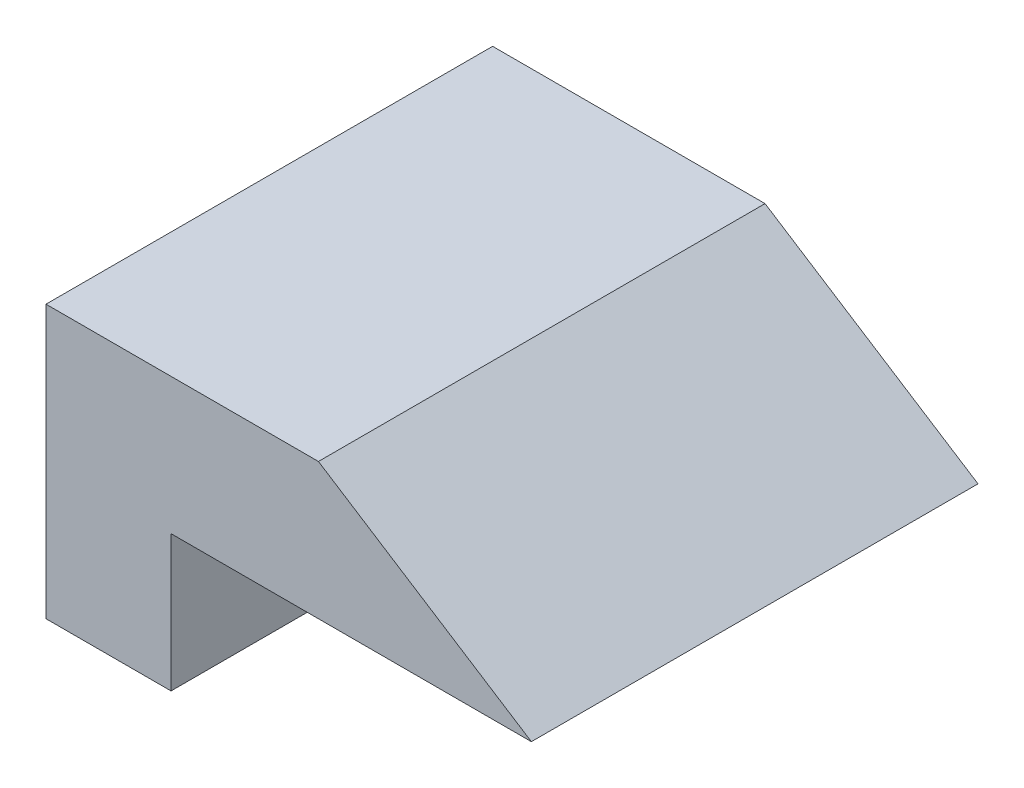
ISO-10303-21;
HEADER;
FILE_DESCRIPTION(('STEP AP214'),'2;1');
FILE_NAME('part.step','',(''),(''),'','','');
FILE_SCHEMA(('AUTOMOTIVE_DESIGN { 1 0 10303 214 1 1 1 1 }'));
ENDSEC;
DATA;
#1=APPLICATION_CONTEXT('core data for automotive mechanical design processes');
#2=APPLICATION_PROTOCOL_DEFINITION('international standard','automotive_design',2000,#1);
#3=PRODUCT_CONTEXT('',#1,'mechanical');
#4=PRODUCT('Part','Part','',(#3));
#5=PRODUCT_RELATED_PRODUCT_CATEGORY('part','',(#4));
#6=PRODUCT_DEFINITION_FORMATION('','',#4);
#7=PRODUCT_DEFINITION_CONTEXT('part definition',#1,'design');
#8=PRODUCT_DEFINITION('design','',#6,#7);
#9=PRODUCT_DEFINITION_SHAPE('','',#8);
#10=(LENGTH_UNIT() NAMED_UNIT(*) SI_UNIT(.MILLI.,.METRE.));
#11=(NAMED_UNIT(*) PLANE_ANGLE_UNIT() SI_UNIT($,.RADIAN.));
#12=(NAMED_UNIT(*) SI_UNIT($,.STERADIAN.) SOLID_ANGLE_UNIT());
#13=UNCERTAINTY_MEASURE_WITH_UNIT(LENGTH_MEASURE(1.E-05),#10,'distance_accuracy_value','');
#14=(GEOMETRIC_REPRESENTATION_CONTEXT(3) GLOBAL_UNCERTAINTY_ASSIGNED_CONTEXT((#13)) GLOBAL_UNIT_ASSIGNED_CONTEXT((#10,
#11,#12)) REPRESENTATION_CONTEXT('',''));
#15=CARTESIAN_POINT('',(0.,0.,0.));
#16=DIRECTION('',(0.,0.,1.));
#17=DIRECTION('',(1.,0.,0.));
#18=AXIS2_PLACEMENT_3D('',#15,#16,#17);
#19=CARTESIAN_POINT('',(0.,3.05,10.));
#20=DIRECTION('',(0.,-1.,0.));
#21=DIRECTION('',(1.,0.,0.));
#22=AXIS2_PLACEMENT_3D('',#19,#20,#21);
#23=PLANE('',#22);
#24=DIRECTION('',(-1.,0.,0.));
#25=VECTOR('',#24,1.);
#26=CARTESIAN_POINT('',(0.,3.05,0.));
#27=LINE('',#26,#25);
#28=CARTESIAN_POINT('',(-4.76772117763126,3.05,0.));
#29=VERTEX_POINT('',#28);
#30=CARTESIAN_POINT('',(-10.8677211776313,3.05,0.));
#31=VERTEX_POINT('',#30);
#32=EDGE_CURVE('E163',#29,#31,#27,.T.);
#33=ORIENTED_EDGE('',*,*,#32,.T.);
#34=DIRECTION('',(0.,0.,-1.));
#35=VECTOR('',#34,1.);
#36=CARTESIAN_POINT('',(-10.8677211776313,3.05,10.));
#37=LINE('',#36,#35);
#38=CARTESIAN_POINT('',(-10.8677211776313,3.05,10.));
#39=VERTEX_POINT('',#38);
#40=EDGE_CURVE('E12',#39,#31,#37,.T.);
#41=ORIENTED_EDGE('',*,*,#40,.F.);
#42=DIRECTION('',(-1.,0.,0.));
#43=VECTOR('',#42,1.);
#44=CARTESIAN_POINT('',(0.,3.05,10.));
#45=LINE('',#44,#43);
#46=CARTESIAN_POINT('',(-4.76772117763126,3.05,10.));
#47=VERTEX_POINT('',#46);
#48=EDGE_CURVE('E92',#47,#39,#45,.T.);
#49=ORIENTED_EDGE('',*,*,#48,.F.);
#50=DIRECTION('',(0.,0.,-1.));
#51=VECTOR('',#50,1.);
#52=CARTESIAN_POINT('',(-4.76772117763126,3.05,10.));
#53=LINE('',#52,#51);
#54=EDGE_CURVE('E124',#47,#29,#53,.T.);
#55=ORIENTED_EDGE('',*,*,#54,.T.);
#56=EDGE_LOOP('',(#33,#41,#49,#55));
#57=FACE_BOUND('',#56,.T.);
#58=ADVANCED_FACE('F42',(#57),#23,.F.);
#59=CARTESIAN_POINT('',(-10.8677211776313,0.,10.));
#60=DIRECTION('',(-1.,0.,0.));
#61=DIRECTION('',(0.,0.,1.));
#62=AXIS2_PLACEMENT_3D('',#59,#60,#61);
#63=PLANE('',#62);
#64=DIRECTION('',(0.,1.,0.));
#65=VECTOR('',#64,1.);
#66=CARTESIAN_POINT('',(-10.8677211776313,0.,0.));
#67=LINE('',#66,#65);
#68=CARTESIAN_POINT('',(-10.8677211776313,-3.05,0.));
#69=VERTEX_POINT('',#68);
#70=EDGE_CURVE('E159',#69,#31,#67,.T.);
#71=ORIENTED_EDGE('',*,*,#70,.F.);
#72=DIRECTION('',(0.,0.,-1.));
#73=VECTOR('',#72,1.);
#74=CARTESIAN_POINT('',(-10.8677211776313,-3.05,10.));
#75=LINE('',#74,#73);
#76=CARTESIAN_POINT('',(-10.8677211776313,-3.05,10.));
#77=VERTEX_POINT('',#76);
#78=EDGE_CURVE('E55',#77,#69,#75,.T.);
#79=ORIENTED_EDGE('',*,*,#78,.F.);
#80=DIRECTION('',(0.,1.,0.));
#81=VECTOR('',#80,1.);
#82=CARTESIAN_POINT('',(-10.8677211776313,0.,10.));
#83=LINE('',#82,#81);
#84=EDGE_CURVE('E138',#77,#39,#83,.T.);
#85=ORIENTED_EDGE('',*,*,#84,.T.);
#86=ORIENTED_EDGE('',*,*,#40,.T.);
#87=EDGE_LOOP('',(#71,#79,#85,#86));
#88=FACE_BOUND('',#87,.T.);
#89=ADVANCED_FACE('F158',(#88),#63,.T.);
#90=CARTESIAN_POINT('',(0.,-3.05,10.));
#91=DIRECTION('',(0.,-1.,0.));
#92=DIRECTION('',(0.,0.,-1.));
#93=AXIS2_PLACEMENT_3D('',#90,#91,#92);
#94=PLANE('',#93);
#95=DIRECTION('',(-1.,0.,0.));
#96=VECTOR('',#95,1.);
#97=CARTESIAN_POINT('',(0.,-3.05,0.));
#98=LINE('',#97,#96);
#99=CARTESIAN_POINT('',(-8.06772117763126,-3.05,0.));
#100=VERTEX_POINT('',#99);
#101=EDGE_CURVE('E157',#100,#69,#98,.T.);
#102=ORIENTED_EDGE('',*,*,#101,.F.);
#103=DIRECTION('',(0.,0.,-1.));
#104=VECTOR('',#103,1.);
#105=CARTESIAN_POINT('',(-8.06772117763126,-3.05,10.));
#106=LINE('',#105,#104);
#107=CARTESIAN_POINT('',(-8.06772117763126,-3.05,10.));
#108=VERTEX_POINT('',#107);
#109=EDGE_CURVE('E119',#108,#100,#106,.T.);
#110=ORIENTED_EDGE('',*,*,#109,.F.);
#111=DIRECTION('',(-1.,0.,0.));
#112=VECTOR('',#111,1.);
#113=CARTESIAN_POINT('',(0.,-3.05,10.));
#114=LINE('',#113,#112);
#115=EDGE_CURVE('E110',#108,#77,#114,.T.);
#116=ORIENTED_EDGE('',*,*,#115,.T.);
#117=ORIENTED_EDGE('',*,*,#78,.T.);
#118=EDGE_LOOP('',(#102,#110,#116,#117));
#119=FACE_BOUND('',#118,.T.);
#120=ADVANCED_FACE('F153',(#119),#94,.T.);
#121=CARTESIAN_POINT('',(-8.06772117763126,0.,10.));
#122=DIRECTION('',(-1.,0.,0.));
#123=DIRECTION('',(0.,0.,1.));
#124=AXIS2_PLACEMENT_3D('',#121,#122,#123);
#125=PLANE('',#124);
#126=DIRECTION('',(0.,1.,0.));
#127=VECTOR('',#126,1.);
#128=CARTESIAN_POINT('',(-8.06772117763126,0.,0.));
#129=LINE('',#128,#127);
#130=CARTESIAN_POINT('',(-8.06772117763126,0.,0.));
#131=VERTEX_POINT('',#130);
#132=EDGE_CURVE('E117',#100,#131,#129,.T.);
#133=ORIENTED_EDGE('',*,*,#132,.T.);
#134=DIRECTION('',(0.,0.,-1.));
#135=VECTOR('',#134,1.);
#136=CARTESIAN_POINT('',(-8.06772117763126,0.,10.));
#137=LINE('',#136,#135);
#138=CARTESIAN_POINT('',(-8.06772117763126,0.,10.));
#139=VERTEX_POINT('',#138);
#140=EDGE_CURVE('E114',#139,#131,#137,.T.);
#141=ORIENTED_EDGE('',*,*,#140,.F.);
#142=DIRECTION('',(0.,1.,0.));
#143=VECTOR('',#142,1.);
#144=CARTESIAN_POINT('',(-8.06772117763126,0.,10.));
#145=LINE('',#144,#143);
#146=EDGE_CURVE('E101',#108,#139,#145,.T.);
#147=ORIENTED_EDGE('',*,*,#146,.F.);
#148=ORIENTED_EDGE('',*,*,#109,.T.);
#149=EDGE_LOOP('',(#133,#141,#147,#148));
#150=FACE_BOUND('',#149,.T.);
#151=ADVANCED_FACE('F113',(#150),#125,.F.);
#152=CARTESIAN_POINT('',(0.,0.,10.));
#153=DIRECTION('',(0.,1.,0.));
#154=DIRECTION('',(0.,0.,1.));
#155=AXIS2_PLACEMENT_3D('',#152,#153,#154);
#156=PLANE('',#155);
#157=DIRECTION('',(1.,0.,0.));
#158=VECTOR('',#157,1.);
#159=CARTESIAN_POINT('',(0.,0.,0.));
#160=LINE('',#159,#158);
#161=CARTESIAN_POINT('',(0.,0.,0.));
#162=VERTEX_POINT('',#161);
#163=EDGE_CURVE('E85',#131,#162,#160,.T.);
#164=ORIENTED_EDGE('',*,*,#163,.T.);
#165=DIRECTION('',(0.,0.,-1.));
#166=VECTOR('',#165,1.);
#167=CARTESIAN_POINT('',(0.,0.,10.));
#168=LINE('',#167,#166);
#169=CARTESIAN_POINT('',(0.,0.,10.));
#170=VERTEX_POINT('',#169);
#171=EDGE_CURVE('E118',#170,#162,#168,.T.);
#172=ORIENTED_EDGE('',*,*,#171,.F.);
#173=DIRECTION('',(1.,0.,0.));
#174=VECTOR('',#173,1.);
#175=CARTESIAN_POINT('',(0.,0.,10.));
#176=LINE('',#175,#174);
#177=EDGE_CURVE('E109',#139,#170,#176,.T.);
#178=ORIENTED_EDGE('',*,*,#177,.F.);
#179=ORIENTED_EDGE('',*,*,#140,.T.);
#180=EDGE_LOOP('',(#164,#172,#178,#179));
#181=FACE_BOUND('',#180,.T.);
#182=ADVANCED_FACE('F123',(#181),#156,.F.);
#183=CARTESIAN_POINT('',(0.,0.,10.));
#184=DIRECTION('',(-0.538885531043225,-0.842379002843887,0.));
#185=DIRECTION('',(0.842379002843887,-0.538885531043225,0.));
#186=AXIS2_PLACEMENT_3D('',#183,#184,#185);
#187=PLANE('',#186);
#188=DIRECTION('',(-0.842379002843887,0.538885531043225,0.));
#189=VECTOR('',#188,1.);
#190=CARTESIAN_POINT('',(0.,0.,0.));
#191=LINE('',#190,#189);
#192=EDGE_CURVE('E88',#162,#29,#191,.T.);
#193=ORIENTED_EDGE('',*,*,#192,.T.);
#194=ORIENTED_EDGE('',*,*,#54,.F.);
#195=DIRECTION('',(-0.842379002843887,0.538885531043225,0.));
#196=VECTOR('',#195,1.);
#197=CARTESIAN_POINT('',(0.,0.,10.));
#198=LINE('',#197,#196);
#199=EDGE_CURVE('E58',#170,#47,#198,.T.);
#200=ORIENTED_EDGE('',*,*,#199,.F.);
#201=ORIENTED_EDGE('',*,*,#171,.T.);
#202=EDGE_LOOP('',(#193,#194,#200,#201));
#203=FACE_BOUND('',#202,.T.);
#204=ADVANCED_FACE('F170',(#203),#187,.F.);
#205=CARTESIAN_POINT('',(0.,0.,10.));
#206=DIRECTION('',(0.,0.,1.));
#207=DIRECTION('',(1.,0.,0.));
#208=AXIS2_PLACEMENT_3D('',#205,#206,#207);
#209=PLANE('',#208);
#210=ORIENTED_EDGE('',*,*,#48,.T.);
#211=ORIENTED_EDGE('',*,*,#84,.F.);
#212=ORIENTED_EDGE('',*,*,#115,.F.);
#213=ORIENTED_EDGE('',*,*,#146,.T.);
#214=ORIENTED_EDGE('',*,*,#177,.T.);
#215=ORIENTED_EDGE('',*,*,#199,.T.);
#216=EDGE_LOOP('',(#210,#211,#212,#213,#214,#215));
#217=FACE_BOUND('',#216,.T.);
#218=ADVANCED_FACE('F106',(#217),#209,.T.);
#219=CARTESIAN_POINT('',(0.,0.,0.));
#220=DIRECTION('',(0.,0.,1.));
#221=DIRECTION('',(1.,0.,0.));
#222=AXIS2_PLACEMENT_3D('',#219,#220,#221);
#223=PLANE('',#222);
#224=ORIENTED_EDGE('',*,*,#32,.F.);
#225=ORIENTED_EDGE('',*,*,#192,.F.);
#226=ORIENTED_EDGE('',*,*,#163,.F.);
#227=ORIENTED_EDGE('',*,*,#132,.F.);
#228=ORIENTED_EDGE('',*,*,#101,.T.);
#229=ORIENTED_EDGE('',*,*,#70,.T.);
#230=EDGE_LOOP('',(#224,#225,#226,#227,#228,#229));
#231=FACE_BOUND('',#230,.T.);
#232=ADVANCED_FACE('F168',(#231),#223,.F.);
#233=CLOSED_SHELL('',(#58,#89,#120,#151,#182,#204,#218,#232));
#234=MANIFOLD_SOLID_BREP('B2',#233);
#235=ADVANCED_BREP_SHAPE_REPRESENTATION('',(#18,#234),#14);
#236=SHAPE_DEFINITION_REPRESENTATION(#9,#235);
ENDSEC;
END-ISO-10303-21;
